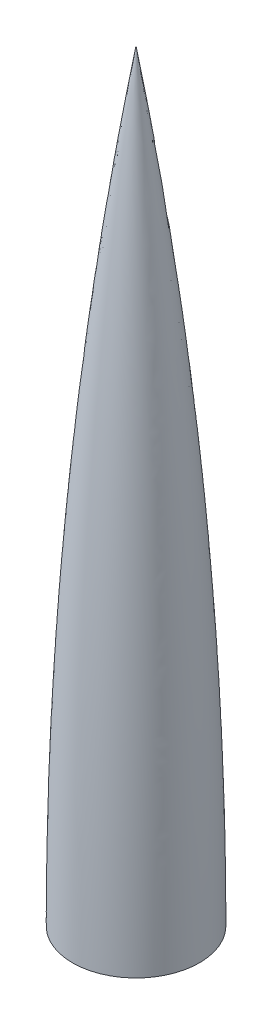
ISO-10303-21;
HEADER;
FILE_DESCRIPTION(('STEP AP214'),'2;1');
FILE_NAME('part.step','',(''),(''),'','','');
FILE_SCHEMA(('AUTOMOTIVE_DESIGN { 1 0 10303 214 1 1 1 1 }'));
ENDSEC;
DATA;
#1=APPLICATION_CONTEXT('core data for automotive mechanical design processes');
#2=APPLICATION_PROTOCOL_DEFINITION('international standard','automotive_design',2000,#1);
#3=PRODUCT_CONTEXT('',#1,'mechanical');
#4=PRODUCT('Part','Part','',(#3));
#5=PRODUCT_RELATED_PRODUCT_CATEGORY('part','',(#4));
#6=PRODUCT_DEFINITION_FORMATION('','',#4);
#7=PRODUCT_DEFINITION_CONTEXT('part definition',#1,'design');
#8=PRODUCT_DEFINITION('design','',#6,#7);
#9=PRODUCT_DEFINITION_SHAPE('','',#8);
#10=(LENGTH_UNIT() NAMED_UNIT(*) SI_UNIT(.MILLI.,.METRE.));
#11=(NAMED_UNIT(*) PLANE_ANGLE_UNIT() SI_UNIT($,.RADIAN.));
#12=(NAMED_UNIT(*) SI_UNIT($,.STERADIAN.) SOLID_ANGLE_UNIT());
#13=UNCERTAINTY_MEASURE_WITH_UNIT(LENGTH_MEASURE(1.E-05),#10,'distance_accuracy_value','');
#14=(GEOMETRIC_REPRESENTATION_CONTEXT(3) GLOBAL_UNCERTAINTY_ASSIGNED_CONTEXT((#13)) GLOBAL_UNIT_ASSIGNED_CONTEXT((#10,
#11,#12)) REPRESENTATION_CONTEXT('',''));
#15=CARTESIAN_POINT('',(0.,0.,0.));
#16=DIRECTION('',(0.,0.,1.));
#17=DIRECTION('',(1.,0.,0.));
#18=AXIS2_PLACEMENT_3D('',#15,#16,#17);
#19=CARTESIAN_POINT('',(0.,0.,0.));
#20=DIRECTION('',(0.,1.,0.));
#21=DIRECTION('',(0.,0.,1.));
#22=AXIS2_PLACEMENT_3D('',#19,#20,#21);
#23=DEGENERATE_TOROIDAL_SURFACE('',#22,3632.19999999999,3681.72999999999,.F.);
#24=CARTESIAN_POINT('',(0.,533.4,0.));
#25=DIRECTION('',(0.,1.,0.));
#26=DIRECTION('',(0.,0.,1.));
#27=AXIS2_PLACEMENT_3D('',#24,#25,#26);
#28=CIRCLE('',#27,10.6862503377729);
#29=CARTESIAN_POINT('',(0.,533.4,10.6862503377729));
#30=VERTEX_POINT('',#29);
#31=EDGE_CURVE('E63',#30,#30,#28,.T.);
#32=ORIENTED_EDGE('',*,*,#31,.T.);
#33=EDGE_LOOP('',(#32));
#34=FACE_BOUND('',#33,.T.);
#35=CARTESIAN_POINT('',(0.,0.,0.));
#36=DIRECTION('',(0.,1.,0.));
#37=DIRECTION('',(0.,0.,1.));
#38=AXIS2_PLACEMENT_3D('',#35,#36,#37);
#39=CIRCLE('',#38,49.53);
#40=CARTESIAN_POINT('',(0.,0.,49.53));
#41=VERTEX_POINT('',#40);
#42=EDGE_CURVE('E41',#41,#41,#39,.T.);
#43=ORIENTED_EDGE('',*,*,#42,.F.);
#44=EDGE_LOOP('',(#43));
#45=FACE_BOUND('',#44,.T.);
#46=ADVANCED_FACE('F35',(#34,#45),#23,.T.);
#47=CARTESIAN_POINT('',(0.,0.,-3632.19999999999));
#48=DIRECTION('',(-1.,0.,0.));
#49=DIRECTION('',(0.,0.,1.));
#50=AXIS2_PLACEMENT_3D('',#47,#48,#49);
#51=CIRCLE('',#50,3682.99999999999);
#52=TRIMMED_CURVE('',#51,(PARAMETER_VALUE(-0.166282463776882)),
(PARAMETER_VALUE(0.166282463776882)),.T.,.PARAMETER.);
#53=CARTESIAN_POINT('',(0.,0.,0.));
#54=DIRECTION('',(0.,1.,0.));
#55=AXIS1_PLACEMENT('',#53,#54);
#56=SURFACE_OF_REVOLUTION('',#52,#55);
#57=CARTESIAN_POINT('',(0.,0.,0.));
#58=DIRECTION('',(0.,1.,0.));
#59=DIRECTION('',(0.,0.,1.));
#60=AXIS2_PLACEMENT_3D('',#57,#58,#59);
#61=CIRCLE('',#60,50.8);
#62=CARTESIAN_POINT('',(0.,0.,50.8));
#63=VERTEX_POINT('',#62);
#64=EDGE_CURVE('E11',#63,#63,#61,.T.);
#65=ORIENTED_EDGE('',*,*,#64,.T.);
#66=EDGE_LOOP('',(#65));
#67=FACE_BOUND('',#66,.T.);
#68=CARTESIAN_POINT('',(0.,609.599999999998,0.));
#69=VERTEX_POINT('',#68);
#70=VERTEX_LOOP('',#69);
#71=FACE_BOUND('',#70,.T.);
#72=ADVANCED_FACE('F44',(#67,#71),#56,.T.);
#73=CARTESIAN_POINT('',(-49.53,0.,0.));
#74=DIRECTION('',(0.,-1.,0.));
#75=DIRECTION('',(0.,0.,-1.));
#76=AXIS2_PLACEMENT_3D('',#73,#74,#75);
#77=PLANE('',#76);
#78=ORIENTED_EDGE('',*,*,#42,.T.);
#79=EDGE_LOOP('',(#78));
#80=FACE_BOUND('',#79,.T.);
#81=ORIENTED_EDGE('',*,*,#64,.F.);
#82=EDGE_LOOP('',(#81));
#83=FACE_BOUND('',#82,.T.);
#84=ADVANCED_FACE('F46',(#80,#83),#77,.T.);
#85=CARTESIAN_POINT('',(-11.9697874824656,533.4,0.));
#86=DIRECTION('',(0.,1.,0.));
#87=DIRECTION('',(0.,0.,1.));
#88=AXIS2_PLACEMENT_3D('',#85,#86,#87);
#89=PLANE('',#88);
#90=ORIENTED_EDGE('',*,*,#31,.F.);
#91=EDGE_LOOP('',(#90));
#92=FACE_BOUND('',#91,.T.);
#93=ADVANCED_FACE('F52',(#92),#89,.F.);
#94=CLOSED_SHELL('',(#46,#72,#84,#93));
#95=MANIFOLD_SOLID_BREP('B2',#94);
#96=ADVANCED_BREP_SHAPE_REPRESENTATION('',(#18,#95),#14);
#97=SHAPE_DEFINITION_REPRESENTATION(#9,#96);
ENDSEC;
END-ISO-10303-21;
